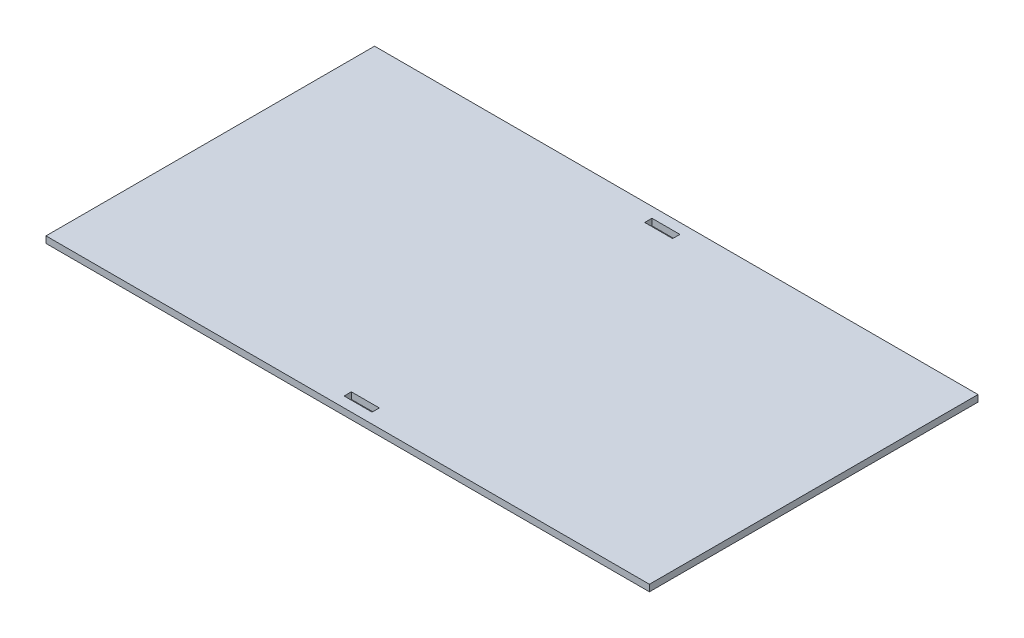
ISO-10303-21;
HEADER;
FILE_DESCRIPTION(('STEP AP214'),'2;1');
FILE_NAME('part.step','',(''),(''),'','','');
FILE_SCHEMA(('AUTOMOTIVE_DESIGN { 1 0 10303 214 1 1 1 1 }'));
ENDSEC;
DATA;
#1=APPLICATION_CONTEXT('core data for automotive mechanical design processes');
#2=APPLICATION_PROTOCOL_DEFINITION('international standard','automotive_design',2000,#1);
#3=PRODUCT_CONTEXT('',#1,'mechanical');
#4=PRODUCT('Part','Part','',(#3));
#5=PRODUCT_RELATED_PRODUCT_CATEGORY('part','',(#4));
#6=PRODUCT_DEFINITION_FORMATION('','',#4);
#7=PRODUCT_DEFINITION_CONTEXT('part definition',#1,'design');
#8=PRODUCT_DEFINITION('design','',#6,#7);
#9=PRODUCT_DEFINITION_SHAPE('','',#8);
#10=(LENGTH_UNIT() NAMED_UNIT(*) SI_UNIT(.MILLI.,.METRE.));
#11=(NAMED_UNIT(*) PLANE_ANGLE_UNIT() SI_UNIT($,.RADIAN.));
#12=(NAMED_UNIT(*) SI_UNIT($,.STERADIAN.) SOLID_ANGLE_UNIT());
#13=UNCERTAINTY_MEASURE_WITH_UNIT(LENGTH_MEASURE(1.E-05),#10,'distance_accuracy_value','');
#14=(GEOMETRIC_REPRESENTATION_CONTEXT(3) GLOBAL_UNCERTAINTY_ASSIGNED_CONTEXT((#13)) GLOBAL_UNIT_ASSIGNED_CONTEXT((#10,
#11,#12)) REPRESENTATION_CONTEXT('',''));
#15=CARTESIAN_POINT('',(0.,0.,0.));
#16=DIRECTION('',(0.,0.,1.));
#17=DIRECTION('',(1.,0.,0.));
#18=AXIS2_PLACEMENT_3D('',#15,#16,#17);
#19=CARTESIAN_POINT('',(0.,2.9972,0.));
#20=DIRECTION('',(0.,-1.,0.));
#21=DIRECTION('',(0.,0.,-1.));
#22=AXIS2_PLACEMENT_3D('',#19,#20,#21);
#23=PLANE('',#22);
#24=DIRECTION('',(0.,0.,1.));
#25=VECTOR('',#24,1.);
#26=CARTESIAN_POINT('',(-6.35000000000001,2.9972,66.675));
#27=LINE('',#26,#25);
#28=CARTESIAN_POINT('',(-6.35000000000001,2.9972,66.675));
#29=VERTEX_POINT('',#28);
#30=CARTESIAN_POINT('',(-6.35000000000001,2.9972,69.977));
#31=VERTEX_POINT('',#30);
#32=EDGE_CURVE('E162',#29,#31,#27,.T.);
#33=ORIENTED_EDGE('',*,*,#32,.F.);
#34=DIRECTION('',(-1.,0.,0.));
#35=VECTOR('',#34,1.);
#36=CARTESIAN_POINT('',(-6.35000000000001,2.9972,66.675));
#37=LINE('',#36,#35);
#38=CARTESIAN_POINT('',(6.35000000000002,2.9972,66.675));
#39=VERTEX_POINT('',#38);
#40=EDGE_CURVE('E170',#39,#29,#37,.T.);
#41=ORIENTED_EDGE('',*,*,#40,.F.);
#42=DIRECTION('',(0.,0.,-1.));
#43=VECTOR('',#42,1.);
#44=CARTESIAN_POINT('',(6.35000000000002,2.9972,66.675));
#45=LINE('',#44,#43);
#46=CARTESIAN_POINT('',(6.35000000000001,2.9972,69.977));
#47=VERTEX_POINT('',#46);
#48=EDGE_CURVE('E167',#47,#39,#45,.T.);
#49=ORIENTED_EDGE('',*,*,#48,.F.);
#50=DIRECTION('',(1.,0.,0.));
#51=VECTOR('',#50,1.);
#52=CARTESIAN_POINT('',(-6.35000000000001,2.9972,69.977));
#53=LINE('',#52,#51);
#54=EDGE_CURVE('E164',#31,#47,#53,.T.);
#55=ORIENTED_EDGE('',*,*,#54,.F.);
#56=EDGE_LOOP('',(#33,#41,#49,#55));
#57=FACE_BOUND('',#56,.T.);
#58=DIRECTION('',(0.,0.,1.));
#59=VECTOR('',#58,1.);
#60=CARTESIAN_POINT('',(-137.16,2.9972,-74.6886999999999));
#61=LINE('',#60,#59);
#62=CARTESIAN_POINT('',(-137.16,2.9972,-74.6886999999999));
#63=VERTEX_POINT('',#62);
#64=CARTESIAN_POINT('',(-137.16,2.9972,74.6887000000001));
#65=VERTEX_POINT('',#64);
#66=EDGE_CURVE('E193',#63,#65,#61,.T.);
#67=ORIENTED_EDGE('',*,*,#66,.T.);
#68=DIRECTION('',(1.,0.,0.));
#69=VECTOR('',#68,1.);
#70=CARTESIAN_POINT('',(137.16,2.9972,74.6887000000001));
#71=LINE('',#70,#69);
#72=CARTESIAN_POINT('',(137.16,2.9972,74.6887000000001));
#73=VERTEX_POINT('',#72);
#74=EDGE_CURVE('E196',#65,#73,#71,.T.);
#75=ORIENTED_EDGE('',*,*,#74,.T.);
#76=DIRECTION('',(0.,0.,-1.));
#77=VECTOR('',#76,1.);
#78=CARTESIAN_POINT('',(137.16,2.9972,-74.6886999999999));
#79=LINE('',#78,#77);
#80=CARTESIAN_POINT('',(137.16,2.9972,-74.6886999999999));
#81=VERTEX_POINT('',#80);
#82=EDGE_CURVE('E199',#73,#81,#79,.T.);
#83=ORIENTED_EDGE('',*,*,#82,.T.);
#84=DIRECTION('',(-1.,0.,0.));
#85=VECTOR('',#84,1.);
#86=CARTESIAN_POINT('',(137.16,2.9972,-74.6886999999999));
#87=LINE('',#86,#85);
#88=EDGE_CURVE('E201',#81,#63,#87,.T.);
#89=ORIENTED_EDGE('',*,*,#88,.T.);
#90=EDGE_LOOP('',(#67,#75,#83,#89));
#91=FACE_BOUND('',#90,.T.);
#92=DIRECTION('',(0.,0.,1.));
#93=VECTOR('',#92,1.);
#94=CARTESIAN_POINT('',(-6.35,2.9972,-66.675));
#95=LINE('',#94,#93);
#96=CARTESIAN_POINT('',(-6.35,2.9972,-69.977));
#97=VERTEX_POINT('',#96);
#98=CARTESIAN_POINT('',(-6.35,2.9972,-66.675));
#99=VERTEX_POINT('',#98);
#100=EDGE_CURVE('E126',#97,#99,#95,.T.);
#101=ORIENTED_EDGE('',*,*,#100,.F.);
#102=DIRECTION('',(-1.,0.,0.));
#103=VECTOR('',#102,1.);
#104=CARTESIAN_POINT('',(-6.35,2.9972,-69.977));
#105=LINE('',#104,#103);
#106=CARTESIAN_POINT('',(6.35,2.9972,-69.977));
#107=VERTEX_POINT('',#106);
#108=EDGE_CURVE('E148',#107,#97,#105,.T.);
#109=ORIENTED_EDGE('',*,*,#108,.F.);
#110=DIRECTION('',(0.,0.,-1.));
#111=VECTOR('',#110,1.);
#112=CARTESIAN_POINT('',(6.35,2.9972,-66.675));
#113=LINE('',#112,#111);
#114=CARTESIAN_POINT('',(6.35,2.9972,-66.675));
#115=VERTEX_POINT('',#114);
#116=EDGE_CURVE('E146',#115,#107,#113,.T.);
#117=ORIENTED_EDGE('',*,*,#116,.F.);
#118=DIRECTION('',(1.,0.,0.));
#119=VECTOR('',#118,1.);
#120=CARTESIAN_POINT('',(-6.35,2.9972,-66.675));
#121=LINE('',#120,#119);
#122=EDGE_CURVE('E134',#99,#115,#121,.T.);
#123=ORIENTED_EDGE('',*,*,#122,.F.);
#124=EDGE_LOOP('',(#101,#109,#117,#123));
#125=FACE_BOUND('',#124,.T.);
#126=ADVANCED_FACE('F37',(#57,#91,#125),#23,.F.);
#127=CARTESIAN_POINT('',(0.,0.,0.));
#128=DIRECTION('',(0.,-1.,0.));
#129=DIRECTION('',(0.,0.,-1.));
#130=AXIS2_PLACEMENT_3D('',#127,#128,#129);
#131=PLANE('',#130);
#132=DIRECTION('',(0.,0.,1.));
#133=VECTOR('',#132,1.);
#134=CARTESIAN_POINT('',(-137.16,0.,-74.6886999999999));
#135=LINE('',#134,#133);
#136=CARTESIAN_POINT('',(-137.16,0.,-74.6886999999999));
#137=VERTEX_POINT('',#136);
#138=CARTESIAN_POINT('',(-137.16,0.,74.6887000000001));
#139=VERTEX_POINT('',#138);
#140=EDGE_CURVE('E192',#137,#139,#135,.T.);
#141=ORIENTED_EDGE('',*,*,#140,.F.);
#142=DIRECTION('',(-1.,0.,0.));
#143=VECTOR('',#142,1.);
#144=CARTESIAN_POINT('',(137.16,0.,-74.6886999999999));
#145=LINE('',#144,#143);
#146=CARTESIAN_POINT('',(137.16,0.,-74.6886999999999));
#147=VERTEX_POINT('',#146);
#148=EDGE_CURVE('E197',#147,#137,#145,.T.);
#149=ORIENTED_EDGE('',*,*,#148,.F.);
#150=DIRECTION('',(0.,0.,-1.));
#151=VECTOR('',#150,1.);
#152=CARTESIAN_POINT('',(137.16,0.,-74.6886999999999));
#153=LINE('',#152,#151);
#154=CARTESIAN_POINT('',(137.16,0.,74.6887000000001));
#155=VERTEX_POINT('',#154);
#156=EDGE_CURVE('E208',#155,#147,#153,.T.);
#157=ORIENTED_EDGE('',*,*,#156,.F.);
#158=DIRECTION('',(1.,0.,0.));
#159=VECTOR('',#158,1.);
#160=CARTESIAN_POINT('',(137.16,0.,74.6887000000001));
#161=LINE('',#160,#159);
#162=EDGE_CURVE('E206',#139,#155,#161,.T.);
#163=ORIENTED_EDGE('',*,*,#162,.F.);
#164=EDGE_LOOP('',(#141,#149,#157,#163));
#165=FACE_BOUND('',#164,.T.);
#166=DIRECTION('',(-1.,0.,0.));
#167=VECTOR('',#166,1.);
#168=CARTESIAN_POINT('',(-6.35000000000001,0.,66.675));
#169=LINE('',#168,#167);
#170=CARTESIAN_POINT('',(6.35000000000002,0.,66.675));
#171=VERTEX_POINT('',#170);
#172=CARTESIAN_POINT('',(-6.35000000000001,0.,66.675));
#173=VERTEX_POINT('',#172);
#174=EDGE_CURVE('E165',#171,#173,#169,.T.);
#175=ORIENTED_EDGE('',*,*,#174,.T.);
#176=DIRECTION('',(0.,0.,1.));
#177=VECTOR('',#176,1.);
#178=CARTESIAN_POINT('',(-6.35000000000001,0.,66.675));
#179=LINE('',#178,#177);
#180=CARTESIAN_POINT('',(-6.35000000000001,0.,69.977));
#181=VERTEX_POINT('',#180);
#182=EDGE_CURVE('E142',#173,#181,#179,.T.);
#183=ORIENTED_EDGE('',*,*,#182,.T.);
#184=DIRECTION('',(1.,0.,0.));
#185=VECTOR('',#184,1.);
#186=CARTESIAN_POINT('',(-6.35000000000001,0.,69.977));
#187=LINE('',#186,#185);
#188=CARTESIAN_POINT('',(6.35000000000001,0.,69.977));
#189=VERTEX_POINT('',#188);
#190=EDGE_CURVE('E175',#181,#189,#187,.T.);
#191=ORIENTED_EDGE('',*,*,#190,.T.);
#192=DIRECTION('',(0.,0.,-1.));
#193=VECTOR('',#192,1.);
#194=CARTESIAN_POINT('',(6.35000000000002,0.,66.675));
#195=LINE('',#194,#193);
#196=EDGE_CURVE('E178',#189,#171,#195,.T.);
#197=ORIENTED_EDGE('',*,*,#196,.T.);
#198=EDGE_LOOP('',(#175,#183,#191,#197));
#199=FACE_BOUND('',#198,.T.);
#200=DIRECTION('',(-1.,0.,0.));
#201=VECTOR('',#200,1.);
#202=CARTESIAN_POINT('',(-6.35,0.,-69.977));
#203=LINE('',#202,#201);
#204=CARTESIAN_POINT('',(6.35,0.,-69.977));
#205=VERTEX_POINT('',#204);
#206=CARTESIAN_POINT('',(-6.35,0.,-69.977));
#207=VERTEX_POINT('',#206);
#208=EDGE_CURVE('E135',#205,#207,#203,.T.);
#209=ORIENTED_EDGE('',*,*,#208,.T.);
#210=DIRECTION('',(0.,0.,1.));
#211=VECTOR('',#210,1.);
#212=CARTESIAN_POINT('',(-6.35,0.,-66.675));
#213=LINE('',#212,#211);
#214=CARTESIAN_POINT('',(-6.35,0.,-66.675));
#215=VERTEX_POINT('',#214);
#216=EDGE_CURVE('E60',#207,#215,#213,.T.);
#217=ORIENTED_EDGE('',*,*,#216,.T.);
#218=DIRECTION('',(1.,0.,0.));
#219=VECTOR('',#218,1.);
#220=CARTESIAN_POINT('',(-6.35,0.,-66.675));
#221=LINE('',#220,#219);
#222=CARTESIAN_POINT('',(6.35,0.,-66.675));
#223=VERTEX_POINT('',#222);
#224=EDGE_CURVE('E141',#215,#223,#221,.T.);
#225=ORIENTED_EDGE('',*,*,#224,.T.);
#226=DIRECTION('',(0.,0.,-1.));
#227=VECTOR('',#226,1.);
#228=CARTESIAN_POINT('',(6.35,0.,-66.675));
#229=LINE('',#228,#227);
#230=EDGE_CURVE('E154',#223,#205,#229,.T.);
#231=ORIENTED_EDGE('',*,*,#230,.T.);
#232=EDGE_LOOP('',(#209,#217,#225,#231));
#233=FACE_BOUND('',#232,.T.);
#234=ADVANCED_FACE('F226',(#165,#199,#233),#131,.T.);
#235=CARTESIAN_POINT('',(-137.16,2.9972,-74.6886999999999));
#236=DIRECTION('',(1.,0.,0.));
#237=DIRECTION('',(0.,0.,-1.));
#238=AXIS2_PLACEMENT_3D('',#235,#236,#237);
#239=PLANE('',#238);
#240=ORIENTED_EDGE('',*,*,#140,.T.);
#241=DIRECTION('',(0.,-1.,0.));
#242=VECTOR('',#241,1.);
#243=CARTESIAN_POINT('',(-137.16,2.9972,74.6887000000001));
#244=LINE('',#243,#242);
#245=EDGE_CURVE('E11',#65,#139,#244,.T.);
#246=ORIENTED_EDGE('',*,*,#245,.F.);
#247=ORIENTED_EDGE('',*,*,#66,.F.);
#248=DIRECTION('',(0.,-1.,0.));
#249=VECTOR('',#248,1.);
#250=CARTESIAN_POINT('',(-137.16,2.9972,-74.6886999999999));
#251=LINE('',#250,#249);
#252=EDGE_CURVE('E203',#63,#137,#251,.T.);
#253=ORIENTED_EDGE('',*,*,#252,.T.);
#254=EDGE_LOOP('',(#240,#246,#247,#253));
#255=FACE_BOUND('',#254,.T.);
#256=ADVANCED_FACE('F39',(#255),#239,.F.);
#257=CARTESIAN_POINT('',(137.16,2.9972,74.6887000000001));
#258=DIRECTION('',(0.,0.,-1.));
#259=DIRECTION('',(-1.,0.,0.));
#260=AXIS2_PLACEMENT_3D('',#257,#258,#259);
#261=PLANE('',#260);
#262=ORIENTED_EDGE('',*,*,#162,.T.);
#263=DIRECTION('',(0.,-1.,0.));
#264=VECTOR('',#263,1.);
#265=CARTESIAN_POINT('',(137.16,2.9972,74.6887000000001));
#266=LINE('',#265,#264);
#267=EDGE_CURVE('E45',#73,#155,#266,.T.);
#268=ORIENTED_EDGE('',*,*,#267,.F.);
#269=ORIENTED_EDGE('',*,*,#74,.F.);
#270=ORIENTED_EDGE('',*,*,#245,.T.);
#271=EDGE_LOOP('',(#262,#268,#269,#270));
#272=FACE_BOUND('',#271,.T.);
#273=ADVANCED_FACE('F236',(#272),#261,.F.);
#274=CARTESIAN_POINT('',(137.16,2.9972,-74.6886999999999));
#275=DIRECTION('',(-1.,0.,0.));
#276=DIRECTION('',(0.,0.,1.));
#277=AXIS2_PLACEMENT_3D('',#274,#275,#276);
#278=PLANE('',#277);
#279=ORIENTED_EDGE('',*,*,#156,.T.);
#280=DIRECTION('',(0.,-1.,0.));
#281=VECTOR('',#280,1.);
#282=CARTESIAN_POINT('',(137.16,2.9972,-74.6886999999999));
#283=LINE('',#282,#281);
#284=EDGE_CURVE('E213',#81,#147,#283,.T.);
#285=ORIENTED_EDGE('',*,*,#284,.F.);
#286=ORIENTED_EDGE('',*,*,#82,.F.);
#287=ORIENTED_EDGE('',*,*,#267,.T.);
#288=EDGE_LOOP('',(#279,#285,#286,#287));
#289=FACE_BOUND('',#288,.T.);
#290=ADVANCED_FACE('F220',(#289),#278,.F.);
#291=CARTESIAN_POINT('',(137.16,2.9972,-74.6886999999999));
#292=DIRECTION('',(0.,0.,1.));
#293=DIRECTION('',(1.,0.,0.));
#294=AXIS2_PLACEMENT_3D('',#291,#292,#293);
#295=PLANE('',#294);
#296=ORIENTED_EDGE('',*,*,#148,.T.);
#297=ORIENTED_EDGE('',*,*,#252,.F.);
#298=ORIENTED_EDGE('',*,*,#88,.F.);
#299=ORIENTED_EDGE('',*,*,#284,.T.);
#300=EDGE_LOOP('',(#296,#297,#298,#299));
#301=FACE_BOUND('',#300,.T.);
#302=ADVANCED_FACE('F230',(#301),#295,.F.);
#303=CARTESIAN_POINT('',(-6.35000000000001,2.9972,66.675));
#304=DIRECTION('',(1.,0.,0.));
#305=DIRECTION('',(0.,0.,-1.));
#306=AXIS2_PLACEMENT_3D('',#303,#304,#305);
#307=PLANE('',#306);
#308=ORIENTED_EDGE('',*,*,#182,.F.);
#309=DIRECTION('',(0.,-1.,0.));
#310=VECTOR('',#309,1.);
#311=CARTESIAN_POINT('',(-6.35000000000001,2.9972,66.675));
#312=LINE('',#311,#310);
#313=EDGE_CURVE('E172',#29,#173,#312,.T.);
#314=ORIENTED_EDGE('',*,*,#313,.F.);
#315=ORIENTED_EDGE('',*,*,#32,.T.);
#316=DIRECTION('',(0.,-1.,0.));
#317=VECTOR('',#316,1.);
#318=CARTESIAN_POINT('',(-6.35000000000001,2.9972,69.977));
#319=LINE('',#318,#317);
#320=EDGE_CURVE('E189',#31,#181,#319,.T.);
#321=ORIENTED_EDGE('',*,*,#320,.T.);
#322=EDGE_LOOP('',(#308,#314,#315,#321));
#323=FACE_BOUND('',#322,.T.);
#324=ADVANCED_FACE('F252',(#323),#307,.T.);
#325=CARTESIAN_POINT('',(-6.35000000000001,2.9972,69.977));
#326=DIRECTION('',(0.,0.,-1.));
#327=DIRECTION('',(-1.,0.,0.));
#328=AXIS2_PLACEMENT_3D('',#325,#326,#327);
#329=PLANE('',#328);
#330=ORIENTED_EDGE('',*,*,#190,.F.);
#331=ORIENTED_EDGE('',*,*,#320,.F.);
#332=ORIENTED_EDGE('',*,*,#54,.T.);
#333=DIRECTION('',(0.,-1.,0.));
#334=VECTOR('',#333,1.);
#335=CARTESIAN_POINT('',(6.35000000000001,2.9972,69.977));
#336=LINE('',#335,#334);
#337=EDGE_CURVE('E187',#47,#189,#336,.T.);
#338=ORIENTED_EDGE('',*,*,#337,.T.);
#339=EDGE_LOOP('',(#330,#331,#332,#338));
#340=FACE_BOUND('',#339,.T.);
#341=ADVANCED_FACE('F259',(#340),#329,.T.);
#342=CARTESIAN_POINT('',(6.35000000000002,2.9972,66.675));
#343=DIRECTION('',(-1.,0.,0.));
#344=DIRECTION('',(0.,0.,1.));
#345=AXIS2_PLACEMENT_3D('',#342,#343,#344);
#346=PLANE('',#345);
#347=ORIENTED_EDGE('',*,*,#196,.F.);
#348=ORIENTED_EDGE('',*,*,#337,.F.);
#349=ORIENTED_EDGE('',*,*,#48,.T.);
#350=DIRECTION('',(0.,-1.,0.));
#351=VECTOR('',#350,1.);
#352=CARTESIAN_POINT('',(6.35000000000002,2.9972,66.675));
#353=LINE('',#352,#351);
#354=EDGE_CURVE('E185',#39,#171,#353,.T.);
#355=ORIENTED_EDGE('',*,*,#354,.T.);
#356=EDGE_LOOP('',(#347,#348,#349,#355));
#357=FACE_BOUND('',#356,.T.);
#358=ADVANCED_FACE('F264',(#357),#346,.T.);
#359=CARTESIAN_POINT('',(-6.35000000000001,2.9972,66.675));
#360=DIRECTION('',(0.,0.,1.));
#361=DIRECTION('',(1.,0.,0.));
#362=AXIS2_PLACEMENT_3D('',#359,#360,#361);
#363=PLANE('',#362);
#364=ORIENTED_EDGE('',*,*,#174,.F.);
#365=ORIENTED_EDGE('',*,*,#354,.F.);
#366=ORIENTED_EDGE('',*,*,#40,.T.);
#367=ORIENTED_EDGE('',*,*,#313,.T.);
#368=EDGE_LOOP('',(#364,#365,#366,#367));
#369=FACE_BOUND('',#368,.T.);
#370=ADVANCED_FACE('F270',(#369),#363,.T.);
#371=CARTESIAN_POINT('',(-6.35,2.9972,-66.675));
#372=DIRECTION('',(1.,0.,0.));
#373=DIRECTION('',(0.,0.,-1.));
#374=AXIS2_PLACEMENT_3D('',#371,#372,#373);
#375=PLANE('',#374);
#376=ORIENTED_EDGE('',*,*,#216,.F.);
#377=DIRECTION('',(0.,-1.,0.));
#378=VECTOR('',#377,1.);
#379=CARTESIAN_POINT('',(-6.35,2.9972,-69.977));
#380=LINE('',#379,#378);
#381=EDGE_CURVE('E130',#97,#207,#380,.T.);
#382=ORIENTED_EDGE('',*,*,#381,.F.);
#383=ORIENTED_EDGE('',*,*,#100,.T.);
#384=DIRECTION('',(0.,-1.,0.));
#385=VECTOR('',#384,1.);
#386=CARTESIAN_POINT('',(-6.35,2.9972,-66.675));
#387=LINE('',#386,#385);
#388=EDGE_CURVE('E129',#99,#215,#387,.T.);
#389=ORIENTED_EDGE('',*,*,#388,.T.);
#390=EDGE_LOOP('',(#376,#382,#383,#389));
#391=FACE_BOUND('',#390,.T.);
#392=ADVANCED_FACE('F128',(#391),#375,.T.);
#393=CARTESIAN_POINT('',(-6.35,2.9972,-66.675));
#394=DIRECTION('',(0.,0.,-1.));
#395=DIRECTION('',(-1.,0.,0.));
#396=AXIS2_PLACEMENT_3D('',#393,#394,#395);
#397=PLANE('',#396);
#398=ORIENTED_EDGE('',*,*,#224,.F.);
#399=ORIENTED_EDGE('',*,*,#388,.F.);
#400=ORIENTED_EDGE('',*,*,#122,.T.);
#401=DIRECTION('',(0.,-1.,0.));
#402=VECTOR('',#401,1.);
#403=CARTESIAN_POINT('',(6.35,2.9972,-66.675));
#404=LINE('',#403,#402);
#405=EDGE_CURVE('E143',#115,#223,#404,.T.);
#406=ORIENTED_EDGE('',*,*,#405,.T.);
#407=EDGE_LOOP('',(#398,#399,#400,#406));
#408=FACE_BOUND('',#407,.T.);
#409=ADVANCED_FACE('F138',(#408),#397,.T.);
#410=CARTESIAN_POINT('',(6.35,2.9972,-66.675));
#411=DIRECTION('',(-1.,0.,0.));
#412=DIRECTION('',(0.,0.,1.));
#413=AXIS2_PLACEMENT_3D('',#410,#411,#412);
#414=PLANE('',#413);
#415=ORIENTED_EDGE('',*,*,#230,.F.);
#416=ORIENTED_EDGE('',*,*,#405,.F.);
#417=ORIENTED_EDGE('',*,*,#116,.T.);
#418=DIRECTION('',(0.,-1.,0.));
#419=VECTOR('',#418,1.);
#420=CARTESIAN_POINT('',(6.35,2.9972,-69.977));
#421=LINE('',#420,#419);
#422=EDGE_CURVE('E52',#107,#205,#421,.T.);
#423=ORIENTED_EDGE('',*,*,#422,.T.);
#424=EDGE_LOOP('',(#415,#416,#417,#423));
#425=FACE_BOUND('',#424,.T.);
#426=ADVANCED_FACE('F289',(#425),#414,.T.);
#427=CARTESIAN_POINT('',(-6.35,2.9972,-69.977));
#428=DIRECTION('',(0.,0.,1.));
#429=DIRECTION('',(1.,0.,0.));
#430=AXIS2_PLACEMENT_3D('',#427,#428,#429);
#431=PLANE('',#430);
#432=ORIENTED_EDGE('',*,*,#208,.F.);
#433=ORIENTED_EDGE('',*,*,#422,.F.);
#434=ORIENTED_EDGE('',*,*,#108,.T.);
#435=ORIENTED_EDGE('',*,*,#381,.T.);
#436=EDGE_LOOP('',(#432,#433,#434,#435));
#437=FACE_BOUND('',#436,.T.);
#438=ADVANCED_FACE('F292',(#437),#431,.T.);
#439=CLOSED_SHELL('',(#126,#234,#256,#273,#290,#302,#324,#341,#358,#370,#392,#409,#426,#438));
#440=MANIFOLD_SOLID_BREP('B2',#439);
#441=ADVANCED_BREP_SHAPE_REPRESENTATION('',(#18,#440),#14);
#442=SHAPE_DEFINITION_REPRESENTATION(#9,#441);
ENDSEC;
END-ISO-10303-21;
